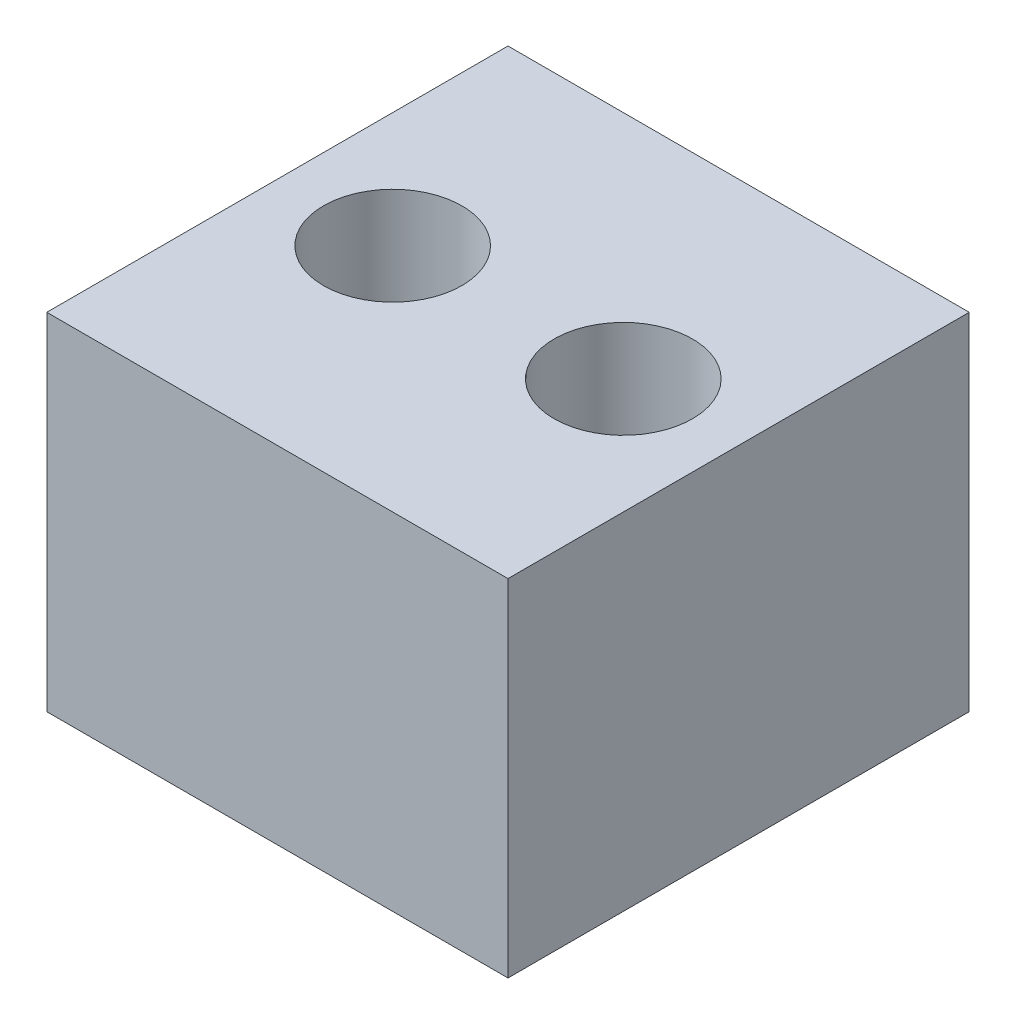
ISO-10303-21;
HEADER;
FILE_DESCRIPTION(('STEP AP214'),'2;1');
FILE_NAME('part.step','',(''),(''),'','','');
FILE_SCHEMA(('AUTOMOTIVE_DESIGN { 1 0 10303 214 1 1 1 1 }'));
ENDSEC;
DATA;
#1=APPLICATION_CONTEXT('core data for automotive mechanical design processes');
#2=APPLICATION_PROTOCOL_DEFINITION('international standard','automotive_design',2000,#1);
#3=PRODUCT_CONTEXT('',#1,'mechanical');
#4=PRODUCT('Part','Part','',(#3));
#5=PRODUCT_RELATED_PRODUCT_CATEGORY('part','',(#4));
#6=PRODUCT_DEFINITION_FORMATION('','',#4);
#7=PRODUCT_DEFINITION_CONTEXT('part definition',#1,'design');
#8=PRODUCT_DEFINITION('design','',#6,#7);
#9=PRODUCT_DEFINITION_SHAPE('','',#8);
#10=(LENGTH_UNIT() NAMED_UNIT(*) SI_UNIT(.MILLI.,.METRE.));
#11=(NAMED_UNIT(*) PLANE_ANGLE_UNIT() SI_UNIT($,.RADIAN.));
#12=(NAMED_UNIT(*) SI_UNIT($,.STERADIAN.) SOLID_ANGLE_UNIT());
#13=UNCERTAINTY_MEASURE_WITH_UNIT(LENGTH_MEASURE(1.E-05),#10,'distance_accuracy_value','');
#14=(GEOMETRIC_REPRESENTATION_CONTEXT(3) GLOBAL_UNCERTAINTY_ASSIGNED_CONTEXT((#13)) GLOBAL_UNIT_ASSIGNED_CONTEXT((#10,
#11,#12)) REPRESENTATION_CONTEXT('',''));
#15=CARTESIAN_POINT('',(0.,0.,0.));
#16=DIRECTION('',(0.,0.,1.));
#17=DIRECTION('',(1.,0.,0.));
#18=AXIS2_PLACEMENT_3D('',#15,#16,#17);
#19=CARTESIAN_POINT('',(10.,15.,-10.));
#20=DIRECTION('',(-1.,0.,0.));
#21=DIRECTION('',(0.,0.,1.));
#22=AXIS2_PLACEMENT_3D('',#19,#20,#21);
#23=PLANE('',#22);
#24=DIRECTION('',(0.,0.,-1.));
#25=VECTOR('',#24,1.);
#26=CARTESIAN_POINT('',(10.,0.,-10.));
#27=LINE('',#26,#25);
#28=CARTESIAN_POINT('',(10.,0.,10.));
#29=VERTEX_POINT('',#28);
#30=CARTESIAN_POINT('',(10.,0.,-10.));
#31=VERTEX_POINT('',#30);
#32=EDGE_CURVE('E106',#29,#31,#27,.T.);
#33=ORIENTED_EDGE('',*,*,#32,.T.);
#34=DIRECTION('',(0.,-1.,0.));
#35=VECTOR('',#34,1.);
#36=CARTESIAN_POINT('',(10.,15.,-10.));
#37=LINE('',#36,#35);
#38=CARTESIAN_POINT('',(10.,15.,-10.));
#39=VERTEX_POINT('',#38);
#40=EDGE_CURVE('E11',#39,#31,#37,.T.);
#41=ORIENTED_EDGE('',*,*,#40,.F.);
#42=DIRECTION('',(0.,0.,-1.));
#43=VECTOR('',#42,1.);
#44=CARTESIAN_POINT('',(10.,15.,-10.));
#45=LINE('',#44,#43);
#46=CARTESIAN_POINT('',(10.,15.,10.));
#47=VERTEX_POINT('',#46);
#48=EDGE_CURVE('E94',#47,#39,#45,.T.);
#49=ORIENTED_EDGE('',*,*,#48,.F.);
#50=DIRECTION('',(0.,-1.,0.));
#51=VECTOR('',#50,1.);
#52=CARTESIAN_POINT('',(10.,15.,10.));
#53=LINE('',#52,#51);
#54=EDGE_CURVE('E102',#47,#29,#53,.T.);
#55=ORIENTED_EDGE('',*,*,#54,.T.);
#56=EDGE_LOOP('',(#33,#41,#49,#55));
#57=FACE_BOUND('',#56,.T.);
#58=ADVANCED_FACE('F43',(#57),#23,.F.);
#59=CARTESIAN_POINT('',(-10.,15.,-10.));
#60=DIRECTION('',(0.,0.,1.));
#61=DIRECTION('',(1.,0.,0.));
#62=AXIS2_PLACEMENT_3D('',#59,#60,#61);
#63=PLANE('',#62);
#64=DIRECTION('',(-1.,0.,0.));
#65=VECTOR('',#64,1.);
#66=CARTESIAN_POINT('',(-10.,0.,-10.));
#67=LINE('',#66,#65);
#68=CARTESIAN_POINT('',(-10.,0.,-10.));
#69=VERTEX_POINT('',#68);
#70=EDGE_CURVE('E98',#31,#69,#67,.T.);
#71=ORIENTED_EDGE('',*,*,#70,.T.);
#72=DIRECTION('',(0.,-1.,0.));
#73=VECTOR('',#72,1.);
#74=CARTESIAN_POINT('',(-10.,15.,-10.));
#75=LINE('',#74,#73);
#76=CARTESIAN_POINT('',(-10.,15.,-10.));
#77=VERTEX_POINT('',#76);
#78=EDGE_CURVE('E51',#77,#69,#75,.T.);
#79=ORIENTED_EDGE('',*,*,#78,.F.);
#80=DIRECTION('',(-1.,0.,0.));
#81=VECTOR('',#80,1.);
#82=CARTESIAN_POINT('',(-10.,15.,-10.));
#83=LINE('',#82,#81);
#84=EDGE_CURVE('E89',#39,#77,#83,.T.);
#85=ORIENTED_EDGE('',*,*,#84,.F.);
#86=ORIENTED_EDGE('',*,*,#40,.T.);
#87=EDGE_LOOP('',(#71,#79,#85,#86));
#88=FACE_BOUND('',#87,.T.);
#89=ADVANCED_FACE('F97',(#88),#63,.F.);
#90=CARTESIAN_POINT('',(-10.,15.,-10.));
#91=DIRECTION('',(1.,0.,0.));
#92=DIRECTION('',(0.,0.,-1.));
#93=AXIS2_PLACEMENT_3D('',#90,#91,#92);
#94=PLANE('',#93);
#95=DIRECTION('',(0.,0.,1.));
#96=VECTOR('',#95,1.);
#97=CARTESIAN_POINT('',(-10.,0.,-10.));
#98=LINE('',#97,#96);
#99=CARTESIAN_POINT('',(-10.,0.,10.));
#100=VERTEX_POINT('',#99);
#101=EDGE_CURVE('E76',#69,#100,#98,.T.);
#102=ORIENTED_EDGE('',*,*,#101,.T.);
#103=DIRECTION('',(0.,-1.,0.));
#104=VECTOR('',#103,1.);
#105=CARTESIAN_POINT('',(-10.,15.,10.));
#106=LINE('',#105,#104);
#107=CARTESIAN_POINT('',(-10.,15.,10.));
#108=VERTEX_POINT('',#107);
#109=EDGE_CURVE('E99',#108,#100,#106,.T.);
#110=ORIENTED_EDGE('',*,*,#109,.F.);
#111=DIRECTION('',(0.,0.,1.));
#112=VECTOR('',#111,1.);
#113=CARTESIAN_POINT('',(-10.,15.,-10.));
#114=LINE('',#113,#112);
#115=EDGE_CURVE('E92',#77,#108,#114,.T.);
#116=ORIENTED_EDGE('',*,*,#115,.F.);
#117=ORIENTED_EDGE('',*,*,#78,.T.);
#118=EDGE_LOOP('',(#102,#110,#116,#117));
#119=FACE_BOUND('',#118,.T.);
#120=ADVANCED_FACE('F100',(#119),#94,.F.);
#121=CARTESIAN_POINT('',(-10.,15.,10.));
#122=DIRECTION('',(0.,0.,-1.));
#123=DIRECTION('',(-1.,0.,0.));
#124=AXIS2_PLACEMENT_3D('',#121,#122,#123);
#125=PLANE('',#124);
#126=DIRECTION('',(1.,0.,0.));
#127=VECTOR('',#126,1.);
#128=CARTESIAN_POINT('',(-10.,0.,10.));
#129=LINE('',#128,#127);
#130=EDGE_CURVE('E82',#100,#29,#129,.T.);
#131=ORIENTED_EDGE('',*,*,#130,.T.);
#132=ORIENTED_EDGE('',*,*,#54,.F.);
#133=DIRECTION('',(1.,0.,0.));
#134=VECTOR('',#133,1.);
#135=CARTESIAN_POINT('',(-10.,15.,10.));
#136=LINE('',#135,#134);
#137=EDGE_CURVE('E59',#108,#47,#136,.T.);
#138=ORIENTED_EDGE('',*,*,#137,.F.);
#139=ORIENTED_EDGE('',*,*,#109,.T.);
#140=EDGE_LOOP('',(#131,#132,#138,#139));
#141=FACE_BOUND('',#140,.T.);
#142=ADVANCED_FACE('F114',(#141),#125,.F.);
#143=CARTESIAN_POINT('',(0.,15.,0.));
#144=DIRECTION('',(0.,1.,0.));
#145=DIRECTION('',(0.,0.,1.));
#146=AXIS2_PLACEMENT_3D('',#143,#144,#145);
#147=PLANE('',#146);
#148=CARTESIAN_POINT('',(5.,15.,0.));
#149=DIRECTION('',(0.,1.,0.));
#150=DIRECTION('',(0.,0.,1.));
#151=AXIS2_PLACEMENT_3D('',#148,#149,#150);
#152=CIRCLE('',#151,3.);
#153=CARTESIAN_POINT('',(5.,15.,3.));
#154=VERTEX_POINT('',#153);
#155=EDGE_CURVE('E126',#154,#154,#152,.T.);
#156=ORIENTED_EDGE('',*,*,#155,.F.);
#157=EDGE_LOOP('',(#156));
#158=FACE_BOUND('',#157,.T.);
#159=CARTESIAN_POINT('',(-5.,15.,0.));
#160=DIRECTION('',(0.,1.,0.));
#161=DIRECTION('',(0.,0.,1.));
#162=AXIS2_PLACEMENT_3D('',#159,#160,#161);
#163=CIRCLE('',#162,3.);
#164=CARTESIAN_POINT('',(-5.,15.,3.));
#165=VERTEX_POINT('',#164);
#166=EDGE_CURVE('E123',#165,#165,#163,.T.);
#167=ORIENTED_EDGE('',*,*,#166,.F.);
#168=EDGE_LOOP('',(#167));
#169=FACE_BOUND('',#168,.T.);
#170=ORIENTED_EDGE('',*,*,#48,.T.);
#171=ORIENTED_EDGE('',*,*,#84,.T.);
#172=ORIENTED_EDGE('',*,*,#115,.T.);
#173=ORIENTED_EDGE('',*,*,#137,.T.);
#174=EDGE_LOOP('',(#170,#171,#172,#173));
#175=FACE_BOUND('',#174,.T.);
#176=ADVANCED_FACE('F90',(#158,#169,#175),#147,.T.);
#177=CARTESIAN_POINT('',(0.,0.,0.));
#178=DIRECTION('',(0.,1.,0.));
#179=DIRECTION('',(0.,0.,1.));
#180=AXIS2_PLACEMENT_3D('',#177,#178,#179);
#181=PLANE('',#180);
#182=ORIENTED_EDGE('',*,*,#32,.F.);
#183=ORIENTED_EDGE('',*,*,#130,.F.);
#184=ORIENTED_EDGE('',*,*,#101,.F.);
#185=ORIENTED_EDGE('',*,*,#70,.F.);
#186=EDGE_LOOP('',(#182,#183,#184,#185));
#187=FACE_BOUND('',#186,.T.);
#188=ADVANCED_FACE('F117',(#187),#181,.F.);
#189=CARTESIAN_POINT('',(-5.,10.,0.));
#190=DIRECTION('',(0.,1.,0.));
#191=DIRECTION('',(0.,0.,1.));
#192=AXIS2_PLACEMENT_3D('',#189,#190,#191);
#193=CYLINDRICAL_SURFACE('',#192,3.);
#194=CARTESIAN_POINT('',(-5.,10.,0.));
#195=DIRECTION('',(0.,1.,0.));
#196=DIRECTION('',(0.,0.,1.));
#197=AXIS2_PLACEMENT_3D('',#194,#195,#196);
#198=CIRCLE('',#197,3.);
#199=CARTESIAN_POINT('',(-5.,10.,3.));
#200=VERTEX_POINT('',#199);
#201=EDGE_CURVE('E120',#200,#200,#198,.T.);
#202=ORIENTED_EDGE('',*,*,#201,.F.);
#203=EDGE_LOOP('',(#202));
#204=FACE_BOUND('',#203,.T.);
#205=ORIENTED_EDGE('',*,*,#166,.T.);
#206=EDGE_LOOP('',(#205));
#207=FACE_BOUND('',#206,.T.);
#208=ADVANCED_FACE('F146',(#204,#207),#193,.F.);
#209=CARTESIAN_POINT('',(-5.,10.,0.));
#210=DIRECTION('',(0.,1.,0.));
#211=DIRECTION('',(0.,0.,1.));
#212=AXIS2_PLACEMENT_3D('',#209,#210,#211);
#213=PLANE('',#212);
#214=ORIENTED_EDGE('',*,*,#201,.T.);
#215=EDGE_LOOP('',(#214));
#216=FACE_BOUND('',#215,.T.);
#217=ADVANCED_FACE('F137',(#216),#213,.T.);
#218=CARTESIAN_POINT('',(5.,10.,0.));
#219=DIRECTION('',(0.,1.,0.));
#220=DIRECTION('',(0.,0.,1.));
#221=AXIS2_PLACEMENT_3D('',#218,#219,#220);
#222=CYLINDRICAL_SURFACE('',#221,3.);
#223=CARTESIAN_POINT('',(5.,10.,0.));
#224=DIRECTION('',(0.,1.,0.));
#225=DIRECTION('',(0.,0.,1.));
#226=AXIS2_PLACEMENT_3D('',#223,#224,#225);
#227=CIRCLE('',#226,3.);
#228=CARTESIAN_POINT('',(5.,10.,3.));
#229=VERTEX_POINT('',#228);
#230=EDGE_CURVE('E109',#229,#229,#227,.T.);
#231=ORIENTED_EDGE('',*,*,#230,.F.);
#232=EDGE_LOOP('',(#231));
#233=FACE_BOUND('',#232,.T.);
#234=ORIENTED_EDGE('',*,*,#155,.T.);
#235=EDGE_LOOP('',(#234));
#236=FACE_BOUND('',#235,.T.);
#237=ADVANCED_FACE('F134',(#233,#236),#222,.F.);
#238=CARTESIAN_POINT('',(5.,10.,0.));
#239=DIRECTION('',(0.,1.,0.));
#240=DIRECTION('',(0.,0.,1.));
#241=AXIS2_PLACEMENT_3D('',#238,#239,#240);
#242=PLANE('',#241);
#243=ORIENTED_EDGE('',*,*,#230,.T.);
#244=EDGE_LOOP('',(#243));
#245=FACE_BOUND('',#244,.T.);
#246=ADVANCED_FACE('F132',(#245),#242,.T.);
#247=CLOSED_SHELL('',(#58,#89,#120,#142,#176,#188,#208,#217,#237,#246));
#248=MANIFOLD_SOLID_BREP('B2',#247);
#249=ADVANCED_BREP_SHAPE_REPRESENTATION('',(#18,#248),#14);
#250=SHAPE_DEFINITION_REPRESENTATION(#9,#249);
ENDSEC;
END-ISO-10303-21;
